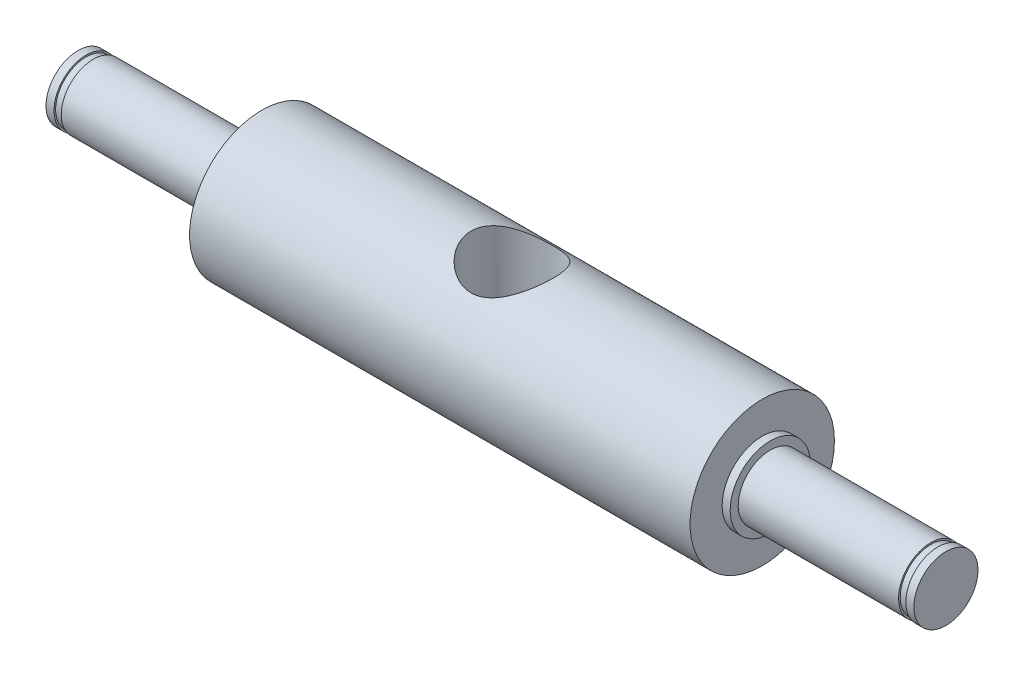
ISO-10303-21;
HEADER;
FILE_DESCRIPTION(('STEP AP214'),'2;1');
FILE_NAME('part.step','',(''),(''),'','','');
FILE_SCHEMA(('AUTOMOTIVE_DESIGN { 1 0 10303 214 1 1 1 1 }'));
ENDSEC;
DATA;
#1=APPLICATION_CONTEXT('core data for automotive mechanical design processes');
#2=APPLICATION_PROTOCOL_DEFINITION('international standard','automotive_design',2000,#1);
#3=PRODUCT_CONTEXT('',#1,'mechanical');
#4=PRODUCT('Part','Part','',(#3));
#5=PRODUCT_RELATED_PRODUCT_CATEGORY('part','',(#4));
#6=PRODUCT_DEFINITION_FORMATION('','',#4);
#7=PRODUCT_DEFINITION_CONTEXT('part definition',#1,'design');
#8=PRODUCT_DEFINITION('design','',#6,#7);
#9=PRODUCT_DEFINITION_SHAPE('','',#8);
#10=(LENGTH_UNIT() NAMED_UNIT(*) SI_UNIT(.MILLI.,.METRE.));
#11=(NAMED_UNIT(*) PLANE_ANGLE_UNIT() SI_UNIT($,.RADIAN.));
#12=(NAMED_UNIT(*) SI_UNIT($,.STERADIAN.) SOLID_ANGLE_UNIT());
#13=UNCERTAINTY_MEASURE_WITH_UNIT(LENGTH_MEASURE(1.E-05),#10,'distance_accuracy_value','');
#14=(GEOMETRIC_REPRESENTATION_CONTEXT(3) GLOBAL_UNCERTAINTY_ASSIGNED_CONTEXT((#13)) GLOBAL_UNIT_ASSIGNED_CONTEXT((#10,
#11,#12)) REPRESENTATION_CONTEXT('',''));
#15=CARTESIAN_POINT('',(0.,0.,0.));
#16=DIRECTION('',(0.,0.,1.));
#17=DIRECTION('',(1.,0.,0.));
#18=AXIS2_PLACEMENT_3D('',#15,#16,#17);
#19=CARTESIAN_POINT('',(0.,-9.,0.));
#20=DIRECTION('',(0.,1.,0.));
#21=DIRECTION('',(0.,0.,1.));
#22=AXIS2_PLACEMENT_3D('',#19,#20,#21);
#23=CYLINDRICAL_SURFACE('',#22,5.1);
#24=CARTESIAN_POINT('',(-5.1,-9.,0.));
#25=CARTESIAN_POINT('',(-5.09999893478383,-8.99999903897023,0.131708217693389));
#26=CARTESIAN_POINT('',(-5.09488967815787,-8.99710110211791,0.263462494409912));
#27=CARTESIAN_POINT('',(-5.07451366649151,-8.98557846430998,0.525990248638634));
#28=CARTESIAN_POINT('',(-5.05924025692676,-8.97695001156293,0.65676302679753));
#29=CARTESIAN_POINT('',(-5.01869157071996,-8.9541601032887,0.916542457939876));
#30=CARTESIAN_POINT('',(-4.99339552226462,-8.93998715763495,1.04554486370082));
#31=CARTESIAN_POINT('',(-4.93310900898221,-8.90645484658374,1.30062388520667));
#32=CARTESIAN_POINT('',(-4.89811439626708,-8.88709326222336,1.42669922404275));
#33=CARTESIAN_POINT('',(-4.81904271782231,-8.84375957581848,1.67440672768443));
#34=CARTESIAN_POINT('',(-4.77501404185589,-8.81981208139661,1.79605865904896));
#35=CARTESIAN_POINT('',(-4.67821181415285,-8.76778238434082,2.03493611124079));
#36=CARTESIAN_POINT('',(-4.62543495666072,-8.73969861914518,2.15215993813997));
#37=CARTESIAN_POINT('',(-4.45476745848163,-8.65017405600478,2.49608486220673));
#38=CARTESIAN_POINT('',(-4.32443396688914,-8.58340023082473,2.71536705730215));
#39=CARTESIAN_POINT('',(-4.02401998929504,-8.4359006662402,3.1449791441098));
#40=CARTESIAN_POINT('',(-3.85176349893267,-8.35451864777396,3.35354717267911));
#41=CARTESIAN_POINT('',(-3.47720198186296,-8.18856857466561,3.74055356306219));
#42=CARTESIAN_POINT('',(-3.27486210480246,-8.10399691090262,3.9189564606038));
#43=CARTESIAN_POINT('',(-2.82011763321458,-7.93060173328772,4.25979734830897));
#44=CARTESIAN_POINT('',(-2.56467661911584,-7.84228367778691,4.41851532161977));
#45=CARTESIAN_POINT('',(-2.16079900779113,-7.7228563829345,4.62208960034658));
#46=CARTESIAN_POINT('',(-2.02273609530976,-7.68522552751784,4.68419251930348));
#47=CARTESIAN_POINT('',(-1.74033338312841,-7.61577744221658,4.79627730688914));
#48=CARTESIAN_POINT('',(-1.59599561455126,-7.58395834820225,4.84626306380186));
#49=CARTESIAN_POINT('',(-1.33416541149977,-7.53374196246923,4.92385797213182));
#50=CARTESIAN_POINT('',(-1.21767791125894,-7.51393085994122,4.95396966322242));
#51=CARTESIAN_POINT('',(-0.982151998282498,-7.47937603455497,5.00598758430907));
#52=CARTESIAN_POINT('',(-0.86311408690044,-7.46463132529283,5.02789541163505));
#53=CARTESIAN_POINT('',(-0.623331994834229,-7.44072079869378,5.06321344996757));
#54=CARTESIAN_POINT('',(-0.502589384686222,-7.431550150544,5.07663101955173));
#55=CARTESIAN_POINT('',(-0.260145100537952,-7.41909845144631,5.09481116457374));
#56=CARTESIAN_POINT('',(-0.138443407135723,-7.41581751995437,5.09957356446636));
#57=CARTESIAN_POINT('',(0.105135552048488,-7.41526839433404,5.10037205320462));
#58=CARTESIAN_POINT('',(0.227012864495865,-7.4180067656697,5.09639861356372));
#59=CARTESIAN_POINT('',(0.46993325291558,-7.4294082920388,5.07976304559724));
#60=CARTESIAN_POINT('',(0.590976008262205,-7.43807360856247,5.067097747443));
#61=CARTESIAN_POINT('',(0.831349077187158,-7.46102061388882,5.03324835307739));
#62=CARTESIAN_POINT('',(0.950679037981664,-7.47530344299993,5.01206252724989));
#63=CARTESIAN_POINT('',(1.18685861586057,-7.5089905745198,4.96144903065465));
#64=CARTESIAN_POINT('',(1.3037072132699,-7.52839693998324,4.93201803957764));
#65=CARTESIAN_POINT('',(1.6488073837083,-7.59327062357103,4.83203746308764));
#66=CARTESIAN_POINT('',(1.87249073268658,-7.64548363935682,4.74967362601612));
#67=CARTESIAN_POINT('',(2.30345300809818,-7.76225811622689,4.55631874392385));
#68=CARTESIAN_POINT('',(2.5107255785083,-7.82682432904339,4.44531667729018));
#69=CARTESIAN_POINT('',(2.93783624029937,-7.97336440402115,4.1775906061817));
#70=CARTESIAN_POINT('',(3.15449733959399,-8.05647752061213,4.01641601393138));
#71=CARTESIAN_POINT('',(3.5598086423156,-8.22363011848613,3.66200147700475));
#72=CARTESIAN_POINT('',(3.74843524004245,-8.30767031715392,3.46873479668756));
#73=CARTESIAN_POINT('',(4.01703520576116,-8.43323339174222,3.14578298097647));
#74=CARTESIAN_POINT('',(4.1080450151536,-8.47705542687915,3.02600507726931));
#75=CARTESIAN_POINT('',(4.27957476836522,-8.56149397264049,2.77811711142258));
#76=CARTESIAN_POINT('',(4.3600986641132,-8.60211168861968,2.65001021576208));
#77=CARTESIAN_POINT('',(4.50989605021509,-8.67899956691312,2.38617820138963));
#78=CARTESIAN_POINT('',(4.57917224127631,-8.71527077232662,2.25045492202507));
#79=CARTESIAN_POINT('',(4.70570338353161,-8.78241237055546,1.97223197547804));
#80=CARTESIAN_POINT('',(4.76295981885365,-8.81328343007013,1.82973314756808));
#81=CARTESIAN_POINT('',(4.86113203590485,-8.86673735484175,1.54916767164897));
#82=CARTESIAN_POINT('',(4.90290818698083,-8.88974773392147,1.41148360306514));
#83=CARTESIAN_POINT('',(4.97481717410861,-8.92960854822429,1.13224234382093));
#84=CARTESIAN_POINT('',(5.00495161880412,-8.94645983448961,0.990685691168465));
#85=CARTESIAN_POINT('',(5.05311165200071,-8.97349096883491,0.705003921945855));
#86=CARTESIAN_POINT('',(5.0711462562428,-8.98367578404663,0.560880800068101));
#87=CARTESIAN_POINT('',(5.09484941797281,-8.99707692679913,0.2713042473921));
#88=CARTESIAN_POINT('',(5.10051930727782,-9.0002940048423,0.125850961562209));
#89=CARTESIAN_POINT('',(5.09947205747004,-8.99970106984888,-0.14763514823474));
#90=CARTESIAN_POINT('',(5.09415091757635,-8.99668299099541,-0.275677755898877));
#91=CARTESIAN_POINT('',(5.07391632201167,-8.98524102698029,-0.530801389065854));
#92=CARTESIAN_POINT('',(5.05899992040044,-8.97681548161842,-0.657882107121428));
#93=CARTESIAN_POINT('',(5.01976612637266,-8.95476350707156,-0.910070372106676));
#94=CARTESIAN_POINT('',(4.99545232337149,-8.94113906367406,-1.0351786534583));
#95=CARTESIAN_POINT('',(4.93770195502957,-8.90900250212738,-1.28267511366891));
#96=CARTESIAN_POINT('',(4.90426187196467,-8.89048849938687,-1.40506222393992));
#97=CARTESIAN_POINT('',(4.82895173104534,-8.84916896583967,-1.6452745126236));
#98=CARTESIAN_POINT('',(4.78715713807618,-8.82640196430097,-1.7631300062477));
#99=CARTESIAN_POINT('',(4.69536282381889,-8.77695523915949,-1.99477036289276));
#100=CARTESIAN_POINT('',(4.64536023765797,-8.75027414975195,-2.10855378767122));
#101=CARTESIAN_POINT('',(4.48368652196741,-8.66515995093143,-2.44290083584297));
#102=CARTESIAN_POINT('',(4.36029626844513,-8.60162593817449,-2.65662882934543));
#103=CARTESIAN_POINT('',(4.07147561886155,-8.45869704602707,-3.08322225535699));
#104=CARTESIAN_POINT('',(3.90300968579725,-8.37834015211186,-3.29369196106322));
#105=CARTESIAN_POINT('',(3.5358950793805,-8.21374543396911,-3.68503972935195));
#106=CARTESIAN_POINT('',(3.33721221171724,-8.12950328930167,-3.86588377896455));
#107=CARTESIAN_POINT('',(2.8899111888997,-7.9557882559204,-4.21271675942007));
#108=CARTESIAN_POINT('',(2.63821537918287,-7.86673693019062,-4.37497584022358));
#109=CARTESIAN_POINT('',(2.10627697157958,-7.70471793325126,-4.65440913777308));
#110=CARTESIAN_POINT('',(1.82607384432316,-7.6317284546497,-4.77164464693502));
#111=CARTESIAN_POINT('',(1.3056780926376,-7.52624646383255,-4.93589428196734));
#112=CARTESIAN_POINT('',(1.0696008694428,-7.48844852776991,-4.9925273956566));
#113=CARTESIAN_POINT('',(0.589429116594686,-7.43510265831224,-5.07164767269172));
#114=CARTESIAN_POINT('',(0.345343672440103,-7.41953034548768,-5.09417225156641));
#115=CARTESIAN_POINT('',(-0.144303440591261,-7.41288068654465,-5.10384633159904));
#116=CARTESIAN_POINT('',(-0.389866955735527,-7.42184666700088,-5.0909332613858));
#117=CARTESIAN_POINT('',(-0.874720571948546,-7.46301750559907,-5.03037191508152));
#118=CARTESIAN_POINT('',(-1.11400657979333,-7.49523715415903,-4.9827015315195));
#119=CARTESIAN_POINT('',(-1.57718273770816,-7.57800056858653,-4.85587091165356));
#120=CARTESIAN_POINT('',(-1.80123075293499,-7.62830450110807,-4.77712156564904));
#121=CARTESIAN_POINT('',(-2.23352708848591,-7.74177262342149,-4.59094809690231));
#122=CARTESIAN_POINT('',(-2.44176944266533,-7.80494163656715,-4.48351321471599));
#123=CARTESIAN_POINT('',(-2.87047988591809,-7.94876109559001,-4.22402889129268));
#124=CARTESIAN_POINT('',(-3.08793146924708,-8.0306070326853,-4.06766557097701));
#125=CARTESIAN_POINT('',(-3.4956489225455,-8.1960232620429,-3.72312830337186));
#126=CARTESIAN_POINT('',(-3.68589172068551,-8.279594949758,-3.53492765113947));
#127=CARTESIAN_POINT('',(-3.95847995868382,-8.40547903093013,-3.21913980487004));
#128=CARTESIAN_POINT('',(-4.05145371928941,-8.44975762262772,-3.10134569147967));
#129=CARTESIAN_POINT('',(-4.22709147389661,-8.53536264546436,-2.8573193853989));
#130=CARTESIAN_POINT('',(-4.30975927598672,-8.57669016460934,-2.73109033608767));
#131=CARTESIAN_POINT('',(-4.46405027808575,-8.65524919479422,-2.47085794457857));
#132=CARTESIAN_POINT('',(-4.53567442226357,-8.69248105591113,-2.33685526833044));
#133=CARTESIAN_POINT('',(-4.66709174537199,-8.76177072231403,-2.06190533803841));
#134=CARTESIAN_POINT('',(-4.7268881915616,-8.79382995602377,-1.92096001529183));
#135=CARTESIAN_POINT('',(-4.82440056244288,-8.84666469699467,-1.65865161102031));
#136=CARTESIAN_POINT('',(-4.86415145865482,-8.86843303393899,-1.53824089253956));
#137=CARTESIAN_POINT('',(-4.93471672341169,-8.90733186241151,-1.29410484080816));
#138=CARTESIAN_POINT('',(-4.96553266362508,-8.92446316956299,-1.17038009468622));
#139=CARTESIAN_POINT('',(-5.01781948120852,-8.95366089533494,-0.920715323587056));
#140=CARTESIAN_POINT('',(-5.03931368408962,-8.96573995332319,-0.794781658056534));
#141=CARTESIAN_POINT('',(-5.0728001242562,-8.98460393405952,-0.541315023880334));
#142=CARTESIAN_POINT('',(-5.08479802471239,-8.99139201207498,-0.413783054562408));
#143=CARTESIAN_POINT('',(-5.09465093245446,-8.99696978741252,-0.238343173117783));
#144=CARTESIAN_POINT('',(-5.09665612747958,-8.99810548984961,-0.190707795961473));
#145=CARTESIAN_POINT('',(-5.09933091138988,-8.99962080256878,-0.095383628665386));
#146=CARTESIAN_POINT('',(-5.10000038574137,-9.00000034801288,-0.0476948342960263));
#147=CARTESIAN_POINT('',(-5.1,-9.,0.));
#148=B_SPLINE_CURVE_WITH_KNOTS('',3,(#24,#25,#26,#27,#28,#29,#30,#31,#32,#33,#34,#35,#36,#37,
#38,#39,#40,#41,#42,#43,#44,#45,#46,#47,#48,#49,#50,#51,#52,#53,#54,#55,#56,#57,#58,#59,#60,#61,
#62,#63,#64,#65,#66,#67,#68,#69,#70,#71,#72,#73,#74,#75,#76,#77,#78,#79,#80,#81,#82,#83,#84,#85,
#86,#87,#88,#89,#90,#91,#92,#93,#94,#95,#96,#97,#98,#99,#100,#101,#102,#103,#104,#105,#106,#107,
#108,#109,#110,#111,#112,#113,#114,#115,#116,#117,#118,#119,#120,#121,#122,#123,#124,#125,#126,
#127,#128,#129,#130,#131,#132,#133,#134,#135,#136,#137,#138,#139,#140,#141,#142,#143,#144,#145,
#146,#147),.UNSPECIFIED.,.T.,.F.,(4,2,2,2,2,2,2,2,2,2,2,2,2,2,2,2,2,2,2,2,2,2,2,2,2,2,2,2,2,2,2,
2,2,2,2,2,2,2,2,2,2,2,2,2,2,2,2,2,2,2,2,2,2,2,2,2,2,2,2,2,2,4),(0.,0.395074510548177,
0.790407933259047,1.18656500231441,1.58289176222796,1.97714861370537,2.37155478769378,
3.15933050308909,4.00344679985966,4.84854870155712,5.78359543489116,6.25102030051977,
6.71829497473876,7.08373344413761,7.44910072394759,7.81415090155996,8.17920848308285,
8.54466444323617,8.91025375217826,9.27591731104997,9.64172833399203,10.3707076331075,
11.0999679043429,11.9442857145908,12.7893104805374,13.2588502109127,13.7282124659269,
14.1974618542913,14.6666532684084,15.1031654553377,15.5396173036941,15.9757435841309,
16.4118228866045,16.7959204752914,17.1801360460591,17.5642050073003,17.948422217496,
18.3293140921613,18.7103391950195,19.4718600204264,20.3124838197271,21.1540660691001,
22.0867907525191,23.0182411405462,23.7521746613947,24.4853025054726,25.2197256475083,
25.9546163290714,26.6801001881942,27.4058565468515,28.2428267799502,29.0805025710971,
29.5493828801152,30.0180894194169,30.4867558647741,30.9552926653148,31.3408560604325,
31.7263515933285,32.1108768668658,32.4951726535595,32.6382267326928,32.781293077718),.UNSPECIFIED.);
#149=CARTESIAN_POINT('',(-5.1,-9.,0.));
#150=VERTEX_POINT('',#149);
#151=EDGE_CURVE('E43',#150,#150,#148,.T.);
#152=ORIENTED_EDGE('',*,*,#151,.F.);
#153=EDGE_LOOP('',(#152));
#154=FACE_BOUND('',#153,.T.);
#155=CARTESIAN_POINT('',(0.,-5.,0.));
#156=DIRECTION('',(0.,1.,0.));
#157=DIRECTION('',(0.,0.,1.));
#158=AXIS2_PLACEMENT_3D('',#155,#156,#157);
#159=CIRCLE('',#158,5.1);
#160=CARTESIAN_POINT('',(0.,-5.,5.1));
#161=VERTEX_POINT('',#160);
#162=EDGE_CURVE('E10',#161,#161,#159,.F.);
#163=ORIENTED_EDGE('',*,*,#162,.F.);
#164=EDGE_LOOP('',(#163));
#165=FACE_BOUND('',#164,.T.);
#166=ADVANCED_FACE('F31',(#154,#165),#23,.F.);
#167=CARTESIAN_POINT('',(31.2,0.,0.));
#168=DIRECTION('',(-1.,0.,0.));
#169=DIRECTION('',(0.,0.,1.));
#170=AXIS2_PLACEMENT_3D('',#167,#168,#169);
#171=CYLINDRICAL_SURFACE('',#170,9.);
#172=ORIENTED_EDGE('',*,*,#151,.T.);
#173=EDGE_LOOP('',(#172));
#174=FACE_BOUND('',#173,.T.);
#175=CARTESIAN_POINT('',(0.,7.41552425658496,5.1));
#176=CARTESIAN_POINT('',(-0.129982594116354,7.41552507713823,5.09999939035067));
#177=CARTESIAN_POINT('',(-0.259973521739506,7.4189547545408,5.09502290004227));
#178=CARTESIAN_POINT('',(-0.518847129087565,7.43252872738314,5.07520022411245));
#179=CARTESIAN_POINT('',(-0.647729707715524,7.44267362890072,5.06035314762771));
#180=CARTESIAN_POINT('',(-0.903444505780235,7.46927263702743,5.02100879213937));
#181=CARTESIAN_POINT('',(-1.03027521276729,7.48573119472966,4.99650470466179));
#182=CARTESIAN_POINT('',(-1.28091948056777,7.5243194676685,4.93820108425617));
#183=CARTESIAN_POINT('',(-1.4047316719767,7.54645170630867,4.90439741479276));
#184=CARTESIAN_POINT('',(-1.76879166380458,7.61987740934639,4.79016358536227));
#185=CARTESIAN_POINT('',(-2.00359582477227,7.6784206334495,4.69660459877378));
#186=CARTESIAN_POINT('',(-2.45394972327052,7.80801575962227,4.47783204848711));
#187=CARTESIAN_POINT('',(-2.66949331698641,7.87907163170839,4.35260843271287));
#188=CARTESIAN_POINT('',(-3.100890017244,8.03497569016563,4.05830039500997));
#189=CARTESIAN_POINT('',(-3.31427209168161,8.12048497232688,3.88594312792454));
#190=CARTESIAN_POINT('',(-3.71117953182008,8.29039466504489,3.50885432905243));
#191=CARTESIAN_POINT('',(-3.89468591225359,8.37479433940429,3.30410237291528));
#192=CARTESIAN_POINT('',(-4.15217703849886,8.49848487372268,2.96514773770889));
#193=CARTESIAN_POINT('',(-4.23812147394977,8.54089241595484,2.84099598672271));
#194=CARTESIAN_POINT('',(-4.39912688490477,8.62191793727739,2.58467823916537));
#195=CARTESIAN_POINT('',(-4.47419231857075,8.66053746656806,2.45251555710397));
#196=CARTESIAN_POINT('',(-4.61264642875505,8.73287043456072,2.18098868821687));
#197=CARTESIAN_POINT('',(-4.67603949231219,8.76658571551078,2.04162723235941));
#198=CARTESIAN_POINT('',(-4.79038622192369,8.82810711511302,1.75663344855315));
#199=CARTESIAN_POINT('',(-4.84134166629115,8.85591407845432,1.61100202058291));
#200=CARTESIAN_POINT('',(-4.92619863044417,8.90260028943925,1.32759249200236));
#201=CARTESIAN_POINT('',(-4.96119963890938,8.92204651604656,1.19023660323225));
#202=CARTESIAN_POINT('',(-5.01973186540951,8.95472594697642,0.912382313236322));
#203=CARTESIAN_POINT('',(-5.0432645813887,8.96795996270577,0.771884324928122));
#204=CARTESIAN_POINT('',(-5.07849770977986,8.98782105334862,0.489039199693985));
#205=CARTESIAN_POINT('',(-5.09020570530772,8.99445236249604,0.346693307223742));
#206=CARTESIAN_POINT('',(-5.10162842197484,9.00092156744156,0.0613717890354113));
#207=CARTESIAN_POINT('',(-5.10134417627572,9.00076004845883,-0.0816037813731662));
#208=CARTESIAN_POINT('',(-5.08949176169029,8.9940485320161,-0.350962679629073));
#209=CARTESIAN_POINT('',(-5.07918300512576,8.98821156769238,-0.477421599752276));
#210=CARTESIAN_POINT('',(-5.04923006105586,8.9713193626842,-0.728915319389473));
#211=CARTESIAN_POINT('',(-5.02958300355477,8.96026251774977,-0.853949668976501));
#212=CARTESIAN_POINT('',(-4.98119174364024,8.93318910686005,-1.1016548329394));
#213=CARTESIAN_POINT('',(-4.95245063789983,8.91717422923644,-1.22432643680655));
#214=CARTESIAN_POINT('',(-4.88619558730119,8.88054920809829,-1.46659171034908));
#215=CARTESIAN_POINT('',(-4.84867825141931,8.85993728848898,-1.58618417040472));
#216=CARTESIAN_POINT('',(-4.72275966378614,8.79143901159993,-1.94136329828454));
#217=CARTESIAN_POINT('',(-4.6214027819243,8.73712720849697,-2.17127524990401));
#218=CARTESIAN_POINT('',(-4.38797631830247,8.61593914277556,-2.61109741791188));
#219=CARTESIAN_POINT('',(-4.25589751121358,8.54905910726834,-2.82100159952539));
#220=CARTESIAN_POINT('',(-3.9479398968714,8.39976802967827,-3.24016980094696));
#221=CARTESIAN_POINT('',(-3.76881353744204,8.31645650690796,-3.44673327491457));
#222=CARTESIAN_POINT('',(-3.38037063579704,8.14777241957192,-3.82851009638919));
#223=CARTESIAN_POINT('',(-3.17101830104513,8.06239751284246,-4.00368571647607));
#224=CARTESIAN_POINT('',(-2.70346368511902,7.88969226713485,-4.33484677558712));
#225=CARTESIAN_POINT('',(-2.44249266233853,7.8029757085962,-4.48732193948702));
#226=CARTESIAN_POINT('',(-2.03089306199091,7.68746855482724,-4.68065050065727));
#227=CARTESIAN_POINT('',(-1.89036733480548,7.65140010504142,-4.73918749288006));
#228=CARTESIAN_POINT('',(-1.60330030591298,7.58558494972642,-4.84383324413096));
#229=CARTESIAN_POINT('',(-1.45676108270155,7.55583608150328,-4.88994625636091));
#230=CARTESIAN_POINT('',(-1.19248624343922,7.50993390051823,-4.96006336478779));
#231=CARTESIAN_POINT('',(-1.07571219715931,7.49222750291587,-4.98670834626491));
#232=CARTESIAN_POINT('',(-0.839931894000824,7.46202581467035,-5.03178993040618));
#233=CARTESIAN_POINT('',(-0.720926070067473,7.44952952401931,-5.05022810829858));
#234=CARTESIAN_POINT('',(-0.481543636826902,7.43018597683049,-5.07864481081357));
#235=CARTESIAN_POINT('',(-0.361168153417031,7.42333437854664,-5.08862983753689));
#236=CARTESIAN_POINT('',(-0.119815148918796,7.4155114304195,-5.10002341315468));
#237=CARTESIAN_POINT('',(0.00116238774553082,7.41454023351031,-5.10143173899125));
#238=CARTESIAN_POINT('',(0.242845687510167,7.41851541728347,-5.09564921882528));
#239=CARTESIAN_POINT('',(0.363551368775279,7.42346338940862,-5.08845606020604));
#240=CARTESIAN_POINT('',(0.603816491970133,7.43910033903189,-5.06556774447437));
#241=CARTESIAN_POINT('',(0.723375500161729,7.44979140798992,-5.0498694900488));
#242=CARTESIAN_POINT('',(0.960524822037344,7.4765450579831,-5.01017423272164));
#243=CARTESIAN_POINT('',(1.07811466683545,7.49260889977922,-4.98617528195499));
#244=CARTESIAN_POINT('',(1.3106135289566,7.52957544126695,-4.93017372474805));
#245=CARTESIAN_POINT('',(1.42552144836796,7.55048008569792,-4.8981679012182));
#246=CARTESIAN_POINT('',(1.76846110312486,7.6201712438943,-4.78962285490139));
#247=CARTESIAN_POINT('',(1.99148915961867,7.67554552526418,-4.70110273437332));
#248=CARTESIAN_POINT('',(2.4203209701136,7.79778858546405,-4.49541462278969));
#249=CARTESIAN_POINT('',(2.62611756631129,7.86466210610434,-4.378234805209));
#250=CARTESIAN_POINT('',(3.05041019145968,8.01557925224445,-4.09634575748887));
#251=CARTESIAN_POINT('',(3.26546799387587,8.10064137352336,-3.92699573402132));
#252=CARTESIAN_POINT('',(3.6661582704391,8.27029148337719,-3.55582173600903));
#253=CARTESIAN_POINT('',(3.85176686788587,8.35487903412745,-3.35397167565329));
#254=CARTESIAN_POINT('',(4.11309966564673,8.47944682634937,-3.01911476126575));
#255=CARTESIAN_POINT('',(4.20058888712263,8.52231782081421,-2.89619450495218));
#256=CARTESIAN_POINT('',(4.3647937856472,8.60443844939541,-2.64223665248293));
#257=CARTESIAN_POINT('',(4.44151377248216,8.64368953001123,-2.51120233395823));
#258=CARTESIAN_POINT('',(4.58339191840237,8.71744299993017,-2.24180484884511));
#259=CARTESIAN_POINT('',(4.64855442949181,8.75194717559276,-2.10344446650293));
#260=CARTESIAN_POINT('',(4.76655427735905,8.81518895875161,-1.82029457187061));
#261=CARTESIAN_POINT('',(4.81939331153981,8.84392736033397,-1.67550594826342));
#262=CARTESIAN_POINT('',(4.90817773468677,8.89263453642427,-1.39280347477956));
#263=CARTESIAN_POINT('',(4.94515553180015,8.91313037565773,-1.25530443378098));
#264=CARTESIAN_POINT('',(5.00758473452627,8.94791771256464,-0.976950299195926));
#265=CARTESIAN_POINT('',(5.03303767481101,8.96221003629958,-0.836095655078951));
#266=CARTESIAN_POINT('',(5.0720244397605,8.98416230914874,-0.552327795099507));
#267=CARTESIAN_POINT('',(5.08556618124709,8.9918266635099,-0.409416010829283));
#268=CARTESIAN_POINT('',(5.10054135900477,9.00030458383976,-0.122761759644329));
#269=CARTESIAN_POINT('',(5.10197591601416,9.00111878391377,0.0209806291502818));
#270=CARTESIAN_POINT('',(5.09324696353545,8.99617457888493,0.291583153077611));
#271=CARTESIAN_POINT('',(5.08438592892166,8.99115426807239,0.418501283945976));
#272=CARTESIAN_POINT('',(5.05725532871953,8.97584012160259,0.671045687470684));
#273=CARTESIAN_POINT('',(5.03898287275787,8.96554466588288,0.796671551158288));
#274=CARTESIAN_POINT('',(4.99325347039792,8.93992282447398,1.04567314036942));
#275=CARTESIAN_POINT('',(4.96579977052199,8.92459821714746,1.16904964503588));
#276=CARTESIAN_POINT('',(4.90202401832858,8.88927127645577,1.41282054765121));
#277=CARTESIAN_POINT('',(4.86569853880345,8.86926713549237,1.53321377330178));
#278=CARTESIAN_POINT('',(4.74363984058575,8.80269202067617,1.88971064435547));
#279=CARTESIAN_POINT('',(4.64497339017449,8.74964449665683,2.12033256344602));
#280=CARTESIAN_POINT('',(4.41682588175242,8.63069514518219,2.5619525682608));
#281=CARTESIAN_POINT('',(4.28733608915795,8.56478967505515,2.77294506787154));
#282=CARTESIAN_POINT('',(3.98505866247728,8.41732807829327,3.19431564067562));
#283=CARTESIAN_POINT('',(3.80907910259602,8.3348481514967,3.4020858078559));
#284=CARTESIAN_POINT('',(3.42695020921995,8.16727656062026,3.78678616565198));
#285=CARTESIAN_POINT('',(3.22076491460741,8.08218188035043,3.96367903772915));
#286=CARTESIAN_POINT('',(2.75904754919162,7.90899589138607,4.29964677945376));
#287=CARTESIAN_POINT('',(2.50063689476114,7.82146605543255,4.45513234322682));
#288=CARTESIAN_POINT('',(2.09261126913259,7.70402823224908,4.65337278189816));
#289=CARTESIAN_POINT('',(1.95323506505832,7.66719856711255,4.71361190572593));
#290=CARTESIAN_POINT('',(1.66834151251879,7.59962221790295,4.82180539631065));
#291=CARTESIAN_POINT('',(1.52282642088999,7.56887332160087,4.86976423260672));
#292=CARTESIAN_POINT('',(1.26414547036379,7.52171565073287,4.94218160586395));
#293=CARTESIAN_POINT('',(1.15207649481671,7.50364607312354,4.96951650596103));
#294=CARTESIAN_POINT('',(0.925712604517972,7.47224146458156,5.01661349831113));
#295=CARTESIAN_POINT('',(0.811418148387842,7.45890546883208,5.03637713383355));
#296=CARTESIAN_POINT('',(0.581318351259025,7.43739323094746,5.06809143434583));
#297=CARTESIAN_POINT('',(0.465513714268466,7.42921466654459,5.08004561583299));
#298=CARTESIAN_POINT('',(0.233141441480684,7.41828071254702,5.09599885017992));
#299=CARTESIAN_POINT('',(0.116574072179451,7.41552352067693,5.10000054676016));
#300=CARTESIAN_POINT('',(0.,7.41552425658496,5.1));
#301=B_SPLINE_CURVE_WITH_KNOTS('',3,(#175,#176,#177,#178,#179,#180,#181,#182,#183,#184,#185,
#186,#187,#188,#189,#190,#191,#192,#193,#194,#195,#196,#197,#198,#199,#200,#201,#202,#203,#204,
#205,#206,#207,#208,#209,#210,#211,#212,#213,#214,#215,#216,#217,#218,#219,#220,#221,#222,#223,
#224,#225,#226,#227,#228,#229,#230,#231,#232,#233,#234,#235,#236,#237,#238,#239,#240,#241,#242,
#243,#244,#245,#246,#247,#248,#249,#250,#251,#252,#253,#254,#255,#256,#257,#258,#259,#260,#261,
#262,#263,#264,#265,#266,#267,#268,#269,#270,#271,#272,#273,#274,#275,#276,#277,#278,#279,#280,
#281,#282,#283,#284,#285,#286,#287,#288,#289,#290,#291,#292,#293,#294,#295,#296,#297,#298,#299,
#300),.UNSPECIFIED.,.T.,.F.,(4,2,2,2,2,2,2,2,2,2,2,2,2,2,2,2,2,2,2,2,2,2,2,2,2,2,2,2,2,2,2,2,2,
2,2,2,2,2,2,2,2,2,2,2,2,2,2,2,2,2,2,2,2,2,2,2,2,2,2,2,2,2,4),(0.,0.389822902059335,
0.779680992107823,1.16981443659904,1.56012169722506,2.33490313601182,3.10993084204289,
3.96849981826138,4.82761228206055,5.2976005662145,5.76739570354083,6.23701390718809,
6.70656492610965,7.13518009241709,7.56373925964469,7.99202341983819,8.42027068235361,
8.80085438219968,9.18155512481102,9.56212637181445,9.94284491030439,10.7105975533237,
11.4785810391432,12.3325111251462,13.1874608273996,14.1253502998123,14.5941001089508,
15.0626892426763,15.4255458715816,15.7883328230843,16.1508404673731,16.5133575395122,
16.8759721008204,17.2387188048519,17.6015506898757,17.9645285922902,18.7002408557685,
19.436257227256,20.2927897648164,21.1500132480688,21.6200362635443,22.0898706389206,
22.5595277193198,23.029120072147,23.460067538228,23.8909576016303,24.321561055495,
24.752124648806,25.1336445310854,25.5152816531471,25.8967839693237,26.2784338952881,
27.044156721002,27.8100967927552,28.6600833596974,29.5110902191127,30.4478134136792,
30.9159625673674,31.3839410903054,31.7338966185722,32.0837807765439,32.4335072773602,
32.783117495796),.UNSPECIFIED.);
#302=CARTESIAN_POINT('',(0.,7.41552425658496,5.1));
#303=VERTEX_POINT('',#302);
#304=EDGE_CURVE('E48',#303,#303,#301,.T.);
#305=ORIENTED_EDGE('',*,*,#304,.T.);
#306=EDGE_LOOP('',(#305));
#307=FACE_BOUND('',#306,.T.);
#308=CARTESIAN_POINT('',(31.2,0.,0.));
#309=DIRECTION('',(1.,0.,0.));
#310=DIRECTION('',(0.,0.,-1.));
#311=AXIS2_PLACEMENT_3D('',#308,#309,#310);
#312=CIRCLE('',#311,9.);
#313=CARTESIAN_POINT('',(31.2,0.,-9.));
#314=VERTEX_POINT('',#313);
#315=EDGE_CURVE('E113',#314,#314,#312,.T.);
#316=ORIENTED_EDGE('',*,*,#315,.F.);
#317=EDGE_LOOP('',(#316));
#318=FACE_BOUND('',#317,.T.);
#319=CARTESIAN_POINT('',(-31.2,0.,0.));
#320=DIRECTION('',(1.,0.,0.));
#321=DIRECTION('',(0.,0.,-1.));
#322=AXIS2_PLACEMENT_3D('',#319,#320,#321);
#323=CIRCLE('',#322,9.);
#324=CARTESIAN_POINT('',(-31.2,0.,-9.));
#325=VERTEX_POINT('',#324);
#326=EDGE_CURVE('E112',#325,#325,#323,.T.);
#327=ORIENTED_EDGE('',*,*,#326,.T.);
#328=EDGE_LOOP('',(#327));
#329=FACE_BOUND('',#328,.T.);
#330=ADVANCED_FACE('F33',(#174,#307,#318,#329),#171,.T.);
#331=CARTESIAN_POINT('',(31.2,0.,0.));
#332=DIRECTION('',(1.,0.,0.));
#333=DIRECTION('',(0.,0.,-1.));
#334=AXIS2_PLACEMENT_3D('',#331,#332,#333);
#335=PLANE('',#334);
#336=CARTESIAN_POINT('',(31.2,0.,0.));
#337=DIRECTION('',(1.,0.,0.));
#338=DIRECTION('',(0.,0.,-1.));
#339=AXIS2_PLACEMENT_3D('',#336,#337,#338);
#340=CIRCLE('',#339,5.);
#341=CARTESIAN_POINT('',(31.2,0.,-5.));
#342=VERTEX_POINT('',#341);
#343=EDGE_CURVE('E39',#342,#342,#340,.T.);
#344=ORIENTED_EDGE('',*,*,#343,.F.);
#345=EDGE_LOOP('',(#344));
#346=FACE_BOUND('',#345,.T.);
#347=ORIENTED_EDGE('',*,*,#315,.T.);
#348=EDGE_LOOP('',(#347));
#349=FACE_BOUND('',#348,.T.);
#350=ADVANCED_FACE('F128',(#346,#349),#335,.T.);
#351=CARTESIAN_POINT('',(-31.2,0.,0.));
#352=DIRECTION('',(1.,0.,0.));
#353=DIRECTION('',(0.,0.,-1.));
#354=AXIS2_PLACEMENT_3D('',#351,#352,#353);
#355=PLANE('',#354);
#356=CARTESIAN_POINT('',(-31.2,0.,0.));
#357=DIRECTION('',(1.,0.,0.));
#358=DIRECTION('',(0.,1.,0.));
#359=AXIS2_PLACEMENT_3D('',#356,#357,#358);
#360=CIRCLE('',#359,5.);
#361=CARTESIAN_POINT('',(-31.2,5.,0.));
#362=VERTEX_POINT('',#361);
#363=EDGE_CURVE('E88',#362,#362,#360,.T.);
#364=ORIENTED_EDGE('',*,*,#363,.T.);
#365=EDGE_LOOP('',(#364));
#366=FACE_BOUND('',#365,.T.);
#367=ORIENTED_EDGE('',*,*,#326,.F.);
#368=EDGE_LOOP('',(#367));
#369=FACE_BOUND('',#368,.T.);
#370=ADVANCED_FACE('F126',(#366,#369),#355,.F.);
#371=CARTESIAN_POINT('',(0.,0.,0.));
#372=DIRECTION('',(0.,1.,0.));
#373=DIRECTION('',(0.,0.,1.));
#374=AXIS2_PLACEMENT_3D('',#371,#372,#373);
#375=CIRCLE('',#374,5.1);
#376=CARTESIAN_POINT('',(0.,0.,5.1));
#377=VERTEX_POINT('',#376);
#378=EDGE_CURVE('E54',#377,#377,#375,.F.);
#379=ORIENTED_EDGE('',*,*,#378,.T.);
#380=EDGE_LOOP('',(#379));
#381=FACE_BOUND('',#380,.T.);
#382=ORIENTED_EDGE('',*,*,#304,.F.);
#383=EDGE_LOOP('',(#382));
#384=FACE_BOUND('',#383,.T.);
#385=ADVANCED_FACE('F120',(#381,#384),#23,.F.);
#386=CARTESIAN_POINT('',(54.1,0.,0.));
#387=DIRECTION('',(1.,0.,0.));
#388=DIRECTION('',(0.,1.,0.));
#389=AXIS2_PLACEMENT_3D('',#386,#387,#388);
#390=CYLINDRICAL_SURFACE('',#389,5.);
#391=ORIENTED_EDGE('',*,*,#343,.T.);
#392=EDGE_LOOP('',(#391));
#393=FACE_BOUND('',#392,.T.);
#394=CARTESIAN_POINT('',(32.2,0.,0.));
#395=DIRECTION('',(1.,0.,0.));
#396=DIRECTION('',(0.,1.,0.));
#397=AXIS2_PLACEMENT_3D('',#394,#395,#396);
#398=CIRCLE('',#397,5.);
#399=CARTESIAN_POINT('',(32.2,5.,0.));
#400=VERTEX_POINT('',#399);
#401=EDGE_CURVE('E109',#400,#400,#398,.T.);
#402=ORIENTED_EDGE('',*,*,#401,.F.);
#403=EDGE_LOOP('',(#402));
#404=FACE_BOUND('',#403,.T.);
#405=ADVANCED_FACE('F125',(#393,#404),#390,.T.);
#406=CARTESIAN_POINT('',(32.2,4.,0.));
#407=DIRECTION('',(1.,0.,0.));
#408=DIRECTION('',(0.,1.,0.));
#409=AXIS2_PLACEMENT_3D('',#406,#407,#408);
#410=PLANE('',#409);
#411=ORIENTED_EDGE('',*,*,#401,.T.);
#412=EDGE_LOOP('',(#411));
#413=FACE_BOUND('',#412,.T.);
#414=CARTESIAN_POINT('',(32.2,0.,0.));
#415=DIRECTION('',(1.,0.,0.));
#416=DIRECTION('',(0.,1.,0.));
#417=AXIS2_PLACEMENT_3D('',#414,#415,#416);
#418=CIRCLE('',#417,4.);
#419=CARTESIAN_POINT('',(32.2,4.,0.));
#420=VERTEX_POINT('',#419);
#421=EDGE_CURVE('E106',#420,#420,#418,.T.);
#422=ORIENTED_EDGE('',*,*,#421,.F.);
#423=EDGE_LOOP('',(#422));
#424=FACE_BOUND('',#423,.T.);
#425=ADVANCED_FACE('F169',(#413,#424),#410,.T.);
#426=CARTESIAN_POINT('',(54.1,0.,0.));
#427=DIRECTION('',(1.,0.,0.));
#428=DIRECTION('',(0.,1.,0.));
#429=AXIS2_PLACEMENT_3D('',#426,#427,#428);
#430=CYLINDRICAL_SURFACE('',#429,4.);
#431=ORIENTED_EDGE('',*,*,#421,.T.);
#432=EDGE_LOOP('',(#431));
#433=FACE_BOUND('',#432,.T.);
#434=CARTESIAN_POINT('',(52.2,0.,0.));
#435=DIRECTION('',(1.,0.,0.));
#436=DIRECTION('',(0.,1.,0.));
#437=AXIS2_PLACEMENT_3D('',#434,#435,#436);
#438=CIRCLE('',#437,4.);
#439=CARTESIAN_POINT('',(52.2,4.,0.));
#440=VERTEX_POINT('',#439);
#441=EDGE_CURVE('E103',#440,#440,#438,.T.);
#442=ORIENTED_EDGE('',*,*,#441,.F.);
#443=EDGE_LOOP('',(#442));
#444=FACE_BOUND('',#443,.T.);
#445=ADVANCED_FACE('F178',(#433,#444),#430,.T.);
#446=CARTESIAN_POINT('',(52.2,4.,0.));
#447=DIRECTION('',(1.,0.,0.));
#448=DIRECTION('',(0.,1.,0.));
#449=AXIS2_PLACEMENT_3D('',#446,#447,#448);
#450=PLANE('',#449);
#451=ORIENTED_EDGE('',*,*,#441,.T.);
#452=EDGE_LOOP('',(#451));
#453=FACE_BOUND('',#452,.T.);
#454=CARTESIAN_POINT('',(52.2,0.,0.));
#455=DIRECTION('',(1.,0.,0.));
#456=DIRECTION('',(0.,1.,0.));
#457=AXIS2_PLACEMENT_3D('',#454,#455,#456);
#458=CIRCLE('',#457,3.8);
#459=CARTESIAN_POINT('',(52.2,3.8,0.));
#460=VERTEX_POINT('',#459);
#461=EDGE_CURVE('E100',#460,#460,#458,.T.);
#462=ORIENTED_EDGE('',*,*,#461,.F.);
#463=EDGE_LOOP('',(#462));
#464=FACE_BOUND('',#463,.T.);
#465=ADVANCED_FACE('F187',(#453,#464),#450,.T.);
#466=CARTESIAN_POINT('',(54.1,0.,0.));
#467=DIRECTION('',(1.,0.,0.));
#468=DIRECTION('',(0.,1.,0.));
#469=AXIS2_PLACEMENT_3D('',#466,#467,#468);
#470=CYLINDRICAL_SURFACE('',#469,3.8);
#471=ORIENTED_EDGE('',*,*,#461,.T.);
#472=EDGE_LOOP('',(#471));
#473=FACE_BOUND('',#472,.T.);
#474=CARTESIAN_POINT('',(53.1,0.,0.));
#475=DIRECTION('',(1.,0.,0.));
#476=DIRECTION('',(0.,1.,0.));
#477=AXIS2_PLACEMENT_3D('',#474,#475,#476);
#478=CIRCLE('',#477,3.8);
#479=CARTESIAN_POINT('',(53.1,3.8,0.));
#480=VERTEX_POINT('',#479);
#481=EDGE_CURVE('E97',#480,#480,#478,.T.);
#482=ORIENTED_EDGE('',*,*,#481,.F.);
#483=EDGE_LOOP('',(#482));
#484=FACE_BOUND('',#483,.T.);
#485=ADVANCED_FACE('F197',(#473,#484),#470,.T.);
#486=CARTESIAN_POINT('',(53.1,3.8,0.));
#487=DIRECTION('',(-1.,0.,0.));
#488=DIRECTION('',(0.,-1.,0.));
#489=AXIS2_PLACEMENT_3D('',#486,#487,#488);
#490=PLANE('',#489);
#491=ORIENTED_EDGE('',*,*,#481,.T.);
#492=EDGE_LOOP('',(#491));
#493=FACE_BOUND('',#492,.T.);
#494=CARTESIAN_POINT('',(53.1,0.,0.));
#495=DIRECTION('',(1.,0.,0.));
#496=DIRECTION('',(0.,1.,0.));
#497=AXIS2_PLACEMENT_3D('',#494,#495,#496);
#498=CIRCLE('',#497,4.);
#499=CARTESIAN_POINT('',(53.1,4.,0.));
#500=VERTEX_POINT('',#499);
#501=EDGE_CURVE('E94',#500,#500,#498,.T.);
#502=ORIENTED_EDGE('',*,*,#501,.F.);
#503=EDGE_LOOP('',(#502));
#504=FACE_BOUND('',#503,.T.);
#505=ADVANCED_FACE('F207',(#493,#504),#490,.T.);
#506=CARTESIAN_POINT('',(54.1,0.,0.));
#507=DIRECTION('',(1.,0.,0.));
#508=DIRECTION('',(0.,1.,0.));
#509=AXIS2_PLACEMENT_3D('',#506,#507,#508);
#510=CYLINDRICAL_SURFACE('',#509,4.);
#511=ORIENTED_EDGE('',*,*,#501,.T.);
#512=EDGE_LOOP('',(#511));
#513=FACE_BOUND('',#512,.T.);
#514=CARTESIAN_POINT('',(54.1,0.,0.));
#515=DIRECTION('',(1.,0.,0.));
#516=DIRECTION('',(0.,1.,0.));
#517=AXIS2_PLACEMENT_3D('',#514,#515,#516);
#518=CIRCLE('',#517,4.);
#519=CARTESIAN_POINT('',(54.1,4.,0.));
#520=VERTEX_POINT('',#519);
#521=EDGE_CURVE('E91',#520,#520,#518,.T.);
#522=ORIENTED_EDGE('',*,*,#521,.F.);
#523=EDGE_LOOP('',(#522));
#524=FACE_BOUND('',#523,.T.);
#525=ADVANCED_FACE('F217',(#513,#524),#510,.T.);
#526=CARTESIAN_POINT('',(54.1,4.,0.));
#527=DIRECTION('',(1.,0.,0.));
#528=DIRECTION('',(0.,1.,0.));
#529=AXIS2_PLACEMENT_3D('',#526,#527,#528);
#530=PLANE('',#529);
#531=ORIENTED_EDGE('',*,*,#521,.T.);
#532=EDGE_LOOP('',(#531));
#533=FACE_BOUND('',#532,.T.);
#534=ADVANCED_FACE('F227',(#533),#530,.T.);
#535=CARTESIAN_POINT('',(-54.1,0.,0.));
#536=DIRECTION('',(-1.,0.,0.));
#537=DIRECTION('',(0.,1.,0.));
#538=AXIS2_PLACEMENT_3D('',#535,#536,#537);
#539=CYLINDRICAL_SURFACE('',#538,5.);
#540=ORIENTED_EDGE('',*,*,#363,.F.);
#541=EDGE_LOOP('',(#540));
#542=FACE_BOUND('',#541,.T.);
#543=CARTESIAN_POINT('',(-32.2,0.,0.));
#544=DIRECTION('',(1.,0.,0.));
#545=DIRECTION('',(0.,1.,0.));
#546=AXIS2_PLACEMENT_3D('',#543,#544,#545);
#547=CIRCLE('',#546,5.);
#548=CARTESIAN_POINT('',(-32.2,5.,0.));
#549=VERTEX_POINT('',#548);
#550=EDGE_CURVE('E85',#549,#549,#547,.T.);
#551=ORIENTED_EDGE('',*,*,#550,.T.);
#552=EDGE_LOOP('',(#551));
#553=FACE_BOUND('',#552,.T.);
#554=ADVANCED_FACE('F236',(#542,#553),#539,.T.);
#555=CARTESIAN_POINT('',(-32.2,4.,0.));
#556=DIRECTION('',(-1.,0.,0.));
#557=DIRECTION('',(0.,1.,0.));
#558=AXIS2_PLACEMENT_3D('',#555,#556,#557);
#559=PLANE('',#558);
#560=ORIENTED_EDGE('',*,*,#550,.F.);
#561=EDGE_LOOP('',(#560));
#562=FACE_BOUND('',#561,.T.);
#563=CARTESIAN_POINT('',(-32.2,0.,0.));
#564=DIRECTION('',(1.,0.,0.));
#565=DIRECTION('',(0.,1.,0.));
#566=AXIS2_PLACEMENT_3D('',#563,#564,#565);
#567=CIRCLE('',#566,4.);
#568=CARTESIAN_POINT('',(-32.2,4.,0.));
#569=VERTEX_POINT('',#568);
#570=EDGE_CURVE('E82',#569,#569,#567,.T.);
#571=ORIENTED_EDGE('',*,*,#570,.T.);
#572=EDGE_LOOP('',(#571));
#573=FACE_BOUND('',#572,.T.);
#574=ADVANCED_FACE('F250',(#562,#573),#559,.T.);
#575=CARTESIAN_POINT('',(-54.1,0.,0.));
#576=DIRECTION('',(-1.,0.,0.));
#577=DIRECTION('',(0.,1.,0.));
#578=AXIS2_PLACEMENT_3D('',#575,#576,#577);
#579=CYLINDRICAL_SURFACE('',#578,4.);
#580=ORIENTED_EDGE('',*,*,#570,.F.);
#581=EDGE_LOOP('',(#580));
#582=FACE_BOUND('',#581,.T.);
#583=CARTESIAN_POINT('',(-52.2,0.,0.));
#584=DIRECTION('',(1.,0.,0.));
#585=DIRECTION('',(0.,1.,0.));
#586=AXIS2_PLACEMENT_3D('',#583,#584,#585);
#587=CIRCLE('',#586,4.);
#588=CARTESIAN_POINT('',(-52.2,4.,0.));
#589=VERTEX_POINT('',#588);
#590=EDGE_CURVE('E79',#589,#589,#587,.T.);
#591=ORIENTED_EDGE('',*,*,#590,.T.);
#592=EDGE_LOOP('',(#591));
#593=FACE_BOUND('',#592,.T.);
#594=ADVANCED_FACE('F260',(#582,#593),#579,.T.);
#595=CARTESIAN_POINT('',(-52.2,4.,0.));
#596=DIRECTION('',(-1.,0.,0.));
#597=DIRECTION('',(0.,1.,0.));
#598=AXIS2_PLACEMENT_3D('',#595,#596,#597);
#599=PLANE('',#598);
#600=ORIENTED_EDGE('',*,*,#590,.F.);
#601=EDGE_LOOP('',(#600));
#602=FACE_BOUND('',#601,.T.);
#603=CARTESIAN_POINT('',(-52.2,0.,0.));
#604=DIRECTION('',(1.,0.,0.));
#605=DIRECTION('',(0.,1.,0.));
#606=AXIS2_PLACEMENT_3D('',#603,#604,#605);
#607=CIRCLE('',#606,3.8);
#608=CARTESIAN_POINT('',(-52.2,3.8,0.));
#609=VERTEX_POINT('',#608);
#610=EDGE_CURVE('E76',#609,#609,#607,.T.);
#611=ORIENTED_EDGE('',*,*,#610,.T.);
#612=EDGE_LOOP('',(#611));
#613=FACE_BOUND('',#612,.T.);
#614=ADVANCED_FACE('F270',(#602,#613),#599,.T.);
#615=CARTESIAN_POINT('',(-54.1,0.,0.));
#616=DIRECTION('',(-1.,0.,0.));
#617=DIRECTION('',(0.,1.,0.));
#618=AXIS2_PLACEMENT_3D('',#615,#616,#617);
#619=CYLINDRICAL_SURFACE('',#618,3.8);
#620=ORIENTED_EDGE('',*,*,#610,.F.);
#621=EDGE_LOOP('',(#620));
#622=FACE_BOUND('',#621,.T.);
#623=CARTESIAN_POINT('',(-53.1,0.,0.));
#624=DIRECTION('',(1.,0.,0.));
#625=DIRECTION('',(0.,1.,0.));
#626=AXIS2_PLACEMENT_3D('',#623,#624,#625);
#627=CIRCLE('',#626,3.8);
#628=CARTESIAN_POINT('',(-53.1,3.8,0.));
#629=VERTEX_POINT('',#628);
#630=EDGE_CURVE('E73',#629,#629,#627,.T.);
#631=ORIENTED_EDGE('',*,*,#630,.T.);
#632=EDGE_LOOP('',(#631));
#633=FACE_BOUND('',#632,.T.);
#634=ADVANCED_FACE('F280',(#622,#633),#619,.T.);
#635=CARTESIAN_POINT('',(-53.1,3.8,0.));
#636=DIRECTION('',(1.,0.,0.));
#637=DIRECTION('',(0.,-1.,0.));
#638=AXIS2_PLACEMENT_3D('',#635,#636,#637);
#639=PLANE('',#638);
#640=ORIENTED_EDGE('',*,*,#630,.F.);
#641=EDGE_LOOP('',(#640));
#642=FACE_BOUND('',#641,.T.);
#643=CARTESIAN_POINT('',(-53.1,0.,0.));
#644=DIRECTION('',(1.,0.,0.));
#645=DIRECTION('',(0.,1.,0.));
#646=AXIS2_PLACEMENT_3D('',#643,#644,#645);
#647=CIRCLE('',#646,4.);
#648=CARTESIAN_POINT('',(-53.1,4.,0.));
#649=VERTEX_POINT('',#648);
#650=EDGE_CURVE('E61',#649,#649,#647,.T.);
#651=ORIENTED_EDGE('',*,*,#650,.T.);
#652=EDGE_LOOP('',(#651));
#653=FACE_BOUND('',#652,.T.);
#654=ADVANCED_FACE('F290',(#642,#653),#639,.T.);
#655=CARTESIAN_POINT('',(-54.1,0.,0.));
#656=DIRECTION('',(-1.,0.,0.));
#657=DIRECTION('',(0.,1.,0.));
#658=AXIS2_PLACEMENT_3D('',#655,#656,#657);
#659=CYLINDRICAL_SURFACE('',#658,4.);
#660=ORIENTED_EDGE('',*,*,#650,.F.);
#661=EDGE_LOOP('',(#660));
#662=FACE_BOUND('',#661,.T.);
#663=CARTESIAN_POINT('',(-54.1,0.,0.));
#664=DIRECTION('',(1.,0.,0.));
#665=DIRECTION('',(0.,1.,0.));
#666=AXIS2_PLACEMENT_3D('',#663,#664,#665);
#667=CIRCLE('',#666,4.);
#668=CARTESIAN_POINT('',(-54.1,4.,0.));
#669=VERTEX_POINT('',#668);
#670=EDGE_CURVE('E56',#669,#669,#667,.T.);
#671=ORIENTED_EDGE('',*,*,#670,.T.);
#672=EDGE_LOOP('',(#671));
#673=FACE_BOUND('',#672,.T.);
#674=ADVANCED_FACE('F300',(#662,#673),#659,.T.);
#675=CARTESIAN_POINT('',(-54.1,4.,0.));
#676=DIRECTION('',(-1.,0.,0.));
#677=DIRECTION('',(0.,1.,0.));
#678=AXIS2_PLACEMENT_3D('',#675,#676,#677);
#679=PLANE('',#678);
#680=ORIENTED_EDGE('',*,*,#670,.F.);
#681=EDGE_LOOP('',(#680));
#682=FACE_BOUND('',#681,.T.);
#683=ADVANCED_FACE('F310',(#682),#679,.T.);
#684=CARTESIAN_POINT('',(0.,-5.,0.));
#685=DIRECTION('',(0.,1.,0.));
#686=DIRECTION('',(0.,0.,1.));
#687=AXIS2_PLACEMENT_3D('',#684,#685,#686);
#688=PLANE('',#687);
#689=CARTESIAN_POINT('',(0.,-5.,0.));
#690=DIRECTION('',(0.,1.,0.));
#691=DIRECTION('',(0.,0.,1.));
#692=AXIS2_PLACEMENT_3D('',#689,#690,#691);
#693=CIRCLE('',#692,3.);
#694=CARTESIAN_POINT('',(0.,-5.,3.));
#695=VERTEX_POINT('',#694);
#696=EDGE_CURVE('E57',#695,#695,#693,.T.);
#697=ORIENTED_EDGE('',*,*,#696,.T.);
#698=EDGE_LOOP('',(#697));
#699=FACE_BOUND('',#698,.T.);
#700=ORIENTED_EDGE('',*,*,#162,.T.);
#701=EDGE_LOOP('',(#700));
#702=FACE_BOUND('',#701,.T.);
#703=ADVANCED_FACE('F319',(#699,#702),#688,.F.);
#704=CARTESIAN_POINT('',(0.,0.,0.));
#705=DIRECTION('',(0.,1.,0.));
#706=DIRECTION('',(0.,0.,1.));
#707=AXIS2_PLACEMENT_3D('',#704,#705,#706);
#708=PLANE('',#707);
#709=CARTESIAN_POINT('',(0.,0.,0.));
#710=DIRECTION('',(0.,1.,0.));
#711=DIRECTION('',(0.,0.,1.));
#712=AXIS2_PLACEMENT_3D('',#709,#710,#711);
#713=CIRCLE('',#712,3.);
#714=CARTESIAN_POINT('',(0.,0.,3.));
#715=VERTEX_POINT('',#714);
#716=EDGE_CURVE('E64',#715,#715,#713,.T.);
#717=ORIENTED_EDGE('',*,*,#716,.F.);
#718=EDGE_LOOP('',(#717));
#719=FACE_BOUND('',#718,.T.);
#720=ORIENTED_EDGE('',*,*,#378,.F.);
#721=EDGE_LOOP('',(#720));
#722=FACE_BOUND('',#721,.T.);
#723=ADVANCED_FACE('F339',(#719,#722),#708,.T.);
#724=CARTESIAN_POINT('',(0.,-5.,0.));
#725=DIRECTION('',(0.,1.,0.));
#726=DIRECTION('',(0.,0.,1.));
#727=AXIS2_PLACEMENT_3D('',#724,#725,#726);
#728=CYLINDRICAL_SURFACE('',#727,3.);
#729=ORIENTED_EDGE('',*,*,#696,.F.);
#730=EDGE_LOOP('',(#729));
#731=FACE_BOUND('',#730,.T.);
#732=ORIENTED_EDGE('',*,*,#716,.T.);
#733=EDGE_LOOP('',(#732));
#734=FACE_BOUND('',#733,.T.);
#735=ADVANCED_FACE('F348',(#731,#734),#728,.F.);
#736=CLOSED_SHELL('',(#166,#330,#350,#370,#385,#405,#425,#445,#465,#485,#505,#525,#534,#554,
#574,#594,#614,#634,#654,#674,#683,#703,#723,#735));
#737=MANIFOLD_SOLID_BREP('B2',#736);
#738=ADVANCED_BREP_SHAPE_REPRESENTATION('',(#18,#737),#14);
#739=SHAPE_DEFINITION_REPRESENTATION(#9,#738);
ENDSEC;
END-ISO-10303-21;
